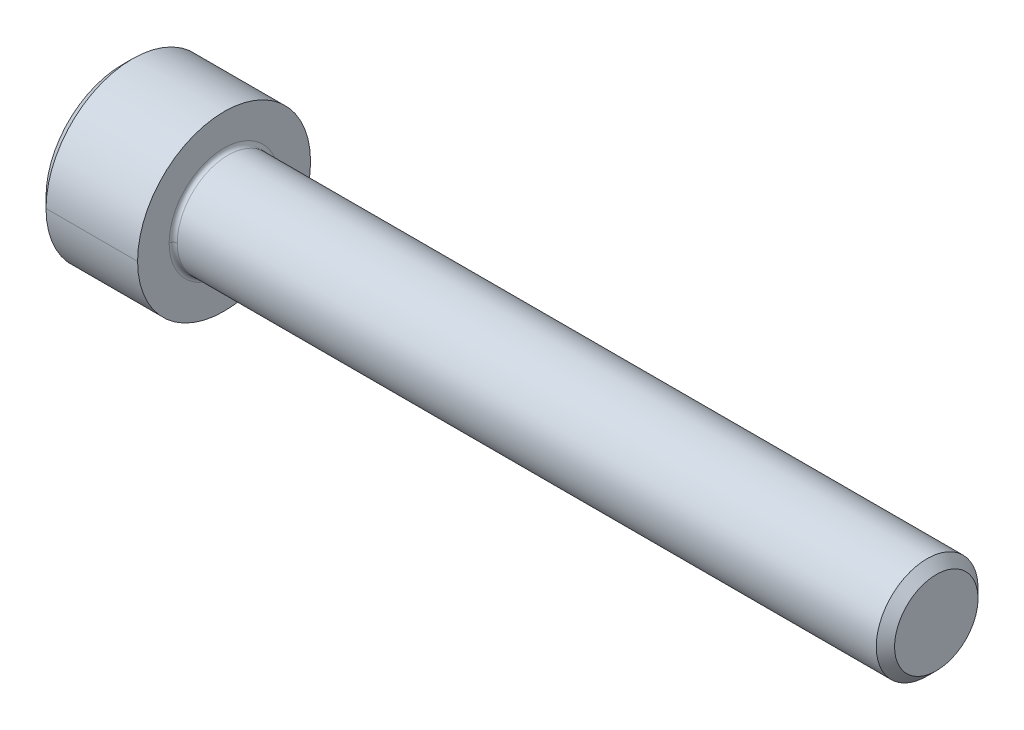
ISO-10303-21;
HEADER;
FILE_DESCRIPTION(('STEP AP214'),'2;1');
FILE_NAME('part.step','',(''),(''),'','','');
FILE_SCHEMA(('AUTOMOTIVE_DESIGN { 1 0 10303 214 1 1 1 1 }'));
ENDSEC;
DATA;
#1=APPLICATION_CONTEXT('core data for automotive mechanical design processes');
#2=APPLICATION_PROTOCOL_DEFINITION('international standard','automotive_design',2000,#1);
#3=PRODUCT_CONTEXT('',#1,'mechanical');
#4=PRODUCT('Part','Part','',(#3));
#5=PRODUCT_RELATED_PRODUCT_CATEGORY('part','',(#4));
#6=PRODUCT_DEFINITION_FORMATION('','',#4);
#7=PRODUCT_DEFINITION_CONTEXT('part definition',#1,'design');
#8=PRODUCT_DEFINITION('design','',#6,#7);
#9=PRODUCT_DEFINITION_SHAPE('','',#8);
#10=(LENGTH_UNIT() NAMED_UNIT(*) SI_UNIT(.MILLI.,.METRE.));
#11=(NAMED_UNIT(*) PLANE_ANGLE_UNIT() SI_UNIT($,.RADIAN.));
#12=(NAMED_UNIT(*) SI_UNIT($,.STERADIAN.) SOLID_ANGLE_UNIT());
#13=UNCERTAINTY_MEASURE_WITH_UNIT(LENGTH_MEASURE(1.E-05),#10,'distance_accuracy_value','');
#14=(GEOMETRIC_REPRESENTATION_CONTEXT(3) GLOBAL_UNCERTAINTY_ASSIGNED_CONTEXT((#13)) GLOBAL_UNIT_ASSIGNED_CONTEXT((#10,
#11,#12)) REPRESENTATION_CONTEXT('',''));
#15=CARTESIAN_POINT('',(0.,0.,0.));
#16=DIRECTION('',(0.,0.,1.));
#17=DIRECTION('',(1.,0.,0.));
#18=AXIS2_PLACEMENT_3D('',#15,#16,#17);
#19=CARTESIAN_POINT('',(2.5,0.,0.));
#20=DIRECTION('',(-1.,0.,0.));
#21=DIRECTION('',(0.,0.,1.));
#22=AXIS2_PLACEMENT_3D('',#19,#20,#21);
#23=CONICAL_SURFACE('',#22,2.042,1.0471975511966);
#24=DIRECTION('',(-0.5,0.,0.866025403784437));
#25=VECTOR('',#24,1.);
#26=CARTESIAN_POINT('',(2.5,0.,2.042));
#27=LINE('',#26,#25);
#28=CARTESIAN_POINT('',(3.67894924968523,0.,0.));
#29=VERTEX_POINT('',#28);
#30=CARTESIAN_POINT('',(2.5,0.,2.042));
#31=VERTEX_POINT('',#30);
#32=EDGE_CURVE('E59',#29,#31,#27,.T.);
#33=ORIENTED_EDGE('',*,*,#32,.F.);
#34=DIRECTION('',(-0.5,0.,-0.866025403784437));
#35=VECTOR('',#34,1.);
#36=CARTESIAN_POINT('',(2.5,0.,-2.042));
#37=LINE('',#36,#35);
#38=CARTESIAN_POINT('',(2.5,0.,-2.042));
#39=VERTEX_POINT('',#38);
#40=EDGE_CURVE('E11',#29,#39,#37,.T.);
#41=ORIENTED_EDGE('',*,*,#40,.T.);
#42=CARTESIAN_POINT('',(2.5,0.,0.));
#43=DIRECTION('',(-1.,0.,0.));
#44=DIRECTION('',(0.,0.,1.));
#45=AXIS2_PLACEMENT_3D('',#42,#43,#44);
#46=CIRCLE('',#45,2.042);
#47=CARTESIAN_POINT('',(2.5,-1.76842387452783,-1.021));
#48=VERTEX_POINT('',#47);
#49=EDGE_CURVE('E47',#39,#48,#46,.T.);
#50=ORIENTED_EDGE('',*,*,#49,.T.);
#51=CARTESIAN_POINT('',(2.5,0.,0.));
#52=DIRECTION('',(-1.,0.,0.));
#53=DIRECTION('',(0.,0.,1.));
#54=AXIS2_PLACEMENT_3D('',#51,#52,#53);
#55=CIRCLE('',#54,2.042);
#56=CARTESIAN_POINT('',(2.5,-1.76842387452783,1.021));
#57=VERTEX_POINT('',#56);
#58=EDGE_CURVE('E225',#48,#57,#55,.T.);
#59=ORIENTED_EDGE('',*,*,#58,.T.);
#60=CARTESIAN_POINT('',(2.5,0.,0.));
#61=DIRECTION('',(-1.,0.,0.));
#62=DIRECTION('',(0.,0.,1.));
#63=AXIS2_PLACEMENT_3D('',#60,#61,#62);
#64=CIRCLE('',#63,2.042);
#65=EDGE_CURVE('E264',#57,#31,#64,.T.);
#66=ORIENTED_EDGE('',*,*,#65,.T.);
#67=EDGE_LOOP('',(#33,#41,#50,#59,#66));
#68=FACE_BOUND('',#67,.T.);
#69=ADVANCED_FACE('F36',(#68),#23,.F.);
#70=CARTESIAN_POINT('',(5.2,0.,0.));
#71=DIRECTION('',(1.,0.,0.));
#72=DIRECTION('',(0.,0.,-1.));
#73=AXIS2_PLACEMENT_3D('',#70,#71,#72);
#74=TOROIDAL_SURFACE('',#73,2.7,0.2);
#75=CARTESIAN_POINT('',(5.2,0.,0.));
#76=DIRECTION('',(1.,0.,0.));
#77=DIRECTION('',(0.,0.,-1.));
#78=AXIS2_PLACEMENT_3D('',#75,#76,#77);
#79=CIRCLE('',#78,2.5);
#80=CARTESIAN_POINT('',(5.2,0.,2.5));
#81=VERTEX_POINT('',#80);
#82=CARTESIAN_POINT('',(5.2,0.,-2.5));
#83=VERTEX_POINT('',#82);
#84=EDGE_CURVE('E84',#81,#83,#79,.T.);
#85=ORIENTED_EDGE('',*,*,#84,.F.);
#86=CARTESIAN_POINT('',(5.2,0.,2.7));
#87=DIRECTION('',(0.,1.,0.));
#88=DIRECTION('',(0.,0.,1.));
#89=AXIS2_PLACEMENT_3D('',#86,#87,#88);
#90=CIRCLE('',#89,0.2);
#91=CARTESIAN_POINT('',(5.,0.,2.7));
#92=VERTEX_POINT('',#91);
#93=EDGE_CURVE('E267',#81,#92,#90,.T.);
#94=ORIENTED_EDGE('',*,*,#93,.T.);
#95=CARTESIAN_POINT('',(5.,0.,0.));
#96=DIRECTION('',(-1.,0.,0.));
#97=DIRECTION('',(0.,0.,-1.));
#98=AXIS2_PLACEMENT_3D('',#95,#96,#97);
#99=CIRCLE('',#98,2.7);
#100=CARTESIAN_POINT('',(5.,0.,-2.7));
#101=VERTEX_POINT('',#100);
#102=EDGE_CURVE('E99',#101,#92,#99,.T.);
#103=ORIENTED_EDGE('',*,*,#102,.F.);
#104=CARTESIAN_POINT('',(5.2,0.,-2.7));
#105=DIRECTION('',(0.,-1.,0.));
#106=DIRECTION('',(0.,0.,-1.));
#107=AXIS2_PLACEMENT_3D('',#104,#105,#106);
#108=CIRCLE('',#107,0.2);
#109=EDGE_CURVE('E237',#83,#101,#108,.T.);
#110=ORIENTED_EDGE('',*,*,#109,.F.);
#111=EDGE_LOOP('',(#85,#94,#103,#110));
#112=FACE_BOUND('',#111,.T.);
#113=ADVANCED_FACE('F397',(#112),#74,.F.);
#114=CARTESIAN_POINT('',(0.,0.,0.));
#115=DIRECTION('',(1.,0.,0.));
#116=DIRECTION('',(0.,0.,-1.));
#117=AXIS2_PLACEMENT_3D('',#114,#115,#116);
#118=CONICAL_SURFACE('',#117,3.75,0.785398163397446);
#119=CARTESIAN_POINT('',(0.,0.,0.));
#120=DIRECTION('',(-1.,0.,0.));
#121=DIRECTION('',(0.,0.,1.));
#122=AXIS2_PLACEMENT_3D('',#119,#120,#121);
#123=CIRCLE('',#122,3.75);
#124=CARTESIAN_POINT('',(0.,0.,3.75));
#125=VERTEX_POINT('',#124);
#126=CARTESIAN_POINT('',(0.,0.,-3.75));
#127=VERTEX_POINT('',#126);
#128=EDGE_CURVE('E281',#125,#127,#123,.T.);
#129=ORIENTED_EDGE('',*,*,#128,.F.);
#130=DIRECTION('',(0.707106781186549,0.,0.707106781186546));
#131=VECTOR('',#130,1.);
#132=CARTESIAN_POINT('',(0.,0.,3.75));
#133=LINE('',#132,#131);
#134=CARTESIAN_POINT('',(0.5,0.,4.25));
#135=VERTEX_POINT('',#134);
#136=EDGE_CURVE('E284',#125,#135,#133,.T.);
#137=ORIENTED_EDGE('',*,*,#136,.T.);
#138=CARTESIAN_POINT('',(0.5,0.,0.));
#139=DIRECTION('',(-1.,0.,0.));
#140=DIRECTION('',(0.,0.,1.));
#141=AXIS2_PLACEMENT_3D('',#138,#139,#140);
#142=CIRCLE('',#141,4.25);
#143=CARTESIAN_POINT('',(0.5,0.,-4.25));
#144=VERTEX_POINT('',#143);
#145=EDGE_CURVE('E299',#135,#144,#142,.T.);
#146=ORIENTED_EDGE('',*,*,#145,.T.);
#147=DIRECTION('',(0.707106781186549,0.,-0.707106781186546));
#148=VECTOR('',#147,1.);
#149=CARTESIAN_POINT('',(0.,0.,-3.75));
#150=LINE('',#149,#148);
#151=EDGE_CURVE('E226',#127,#144,#150,.T.);
#152=ORIENTED_EDGE('',*,*,#151,.F.);
#153=EDGE_LOOP('',(#129,#137,#146,#152));
#154=FACE_BOUND('',#153,.T.);
#155=ADVANCED_FACE('F38',(#154),#118,.T.);
#156=CARTESIAN_POINT('',(-31.75,0.,0.));
#157=DIRECTION('',(-1.,0.,0.));
#158=DIRECTION('',(0.,0.,1.));
#159=AXIS2_PLACEMENT_3D('',#156,#157,#158);
#160=CYLINDRICAL_SURFACE('',#159,4.25);
#161=CARTESIAN_POINT('',(5.,0.,0.));
#162=DIRECTION('',(-1.,0.,0.));
#163=DIRECTION('',(0.,0.,1.));
#164=AXIS2_PLACEMENT_3D('',#161,#162,#163);
#165=CIRCLE('',#164,4.25);
#166=CARTESIAN_POINT('',(5.,0.,4.25));
#167=VERTEX_POINT('',#166);
#168=CARTESIAN_POINT('',(5.,0.,-4.25));
#169=VERTEX_POINT('',#168);
#170=EDGE_CURVE('E295',#167,#169,#165,.T.);
#171=ORIENTED_EDGE('',*,*,#170,.T.);
#172=DIRECTION('',(-1.,0.,0.));
#173=VECTOR('',#172,1.);
#174=CARTESIAN_POINT('',(-31.75,0.,-4.25));
#175=LINE('',#174,#173);
#176=EDGE_CURVE('E300',#169,#144,#175,.T.);
#177=ORIENTED_EDGE('',*,*,#176,.T.);
#178=ORIENTED_EDGE('',*,*,#145,.F.);
#179=DIRECTION('',(-1.,0.,0.));
#180=VECTOR('',#179,1.);
#181=CARTESIAN_POINT('',(-31.75,0.,4.25));
#182=LINE('',#181,#180);
#183=EDGE_CURVE('E229',#167,#135,#182,.T.);
#184=ORIENTED_EDGE('',*,*,#183,.F.);
#185=EDGE_LOOP('',(#171,#177,#178,#184));
#186=FACE_BOUND('',#185,.T.);
#187=ADVANCED_FACE('F326',(#186),#160,.T.);
#188=CARTESIAN_POINT('',(-31.75,0.,0.));
#189=DIRECTION('',(-1.,0.,0.));
#190=DIRECTION('',(0.,0.,1.));
#191=AXIS2_PLACEMENT_3D('',#188,#189,#190);
#192=CYLINDRICAL_SURFACE('',#191,2.5);
#193=CARTESIAN_POINT('',(5.2,0.,0.));
#194=DIRECTION('',(1.,0.,0.));
#195=DIRECTION('',(0.,0.,-1.));
#196=AXIS2_PLACEMENT_3D('',#193,#194,#195);
#197=CIRCLE('',#196,2.5);
#198=EDGE_CURVE('E280',#83,#81,#197,.T.);
#199=ORIENTED_EDGE('',*,*,#198,.T.);
#200=ORIENTED_EDGE('',*,*,#84,.T.);
#201=EDGE_LOOP('',(#199,#200));
#202=FACE_BOUND('',#201,.T.);
#203=CARTESIAN_POINT('',(39.55,0.,0.));
#204=DIRECTION('',(-1.,0.,0.));
#205=DIRECTION('',(0.,0.,1.));
#206=AXIS2_PLACEMENT_3D('',#203,#204,#205);
#207=CIRCLE('',#206,2.5);
#208=CARTESIAN_POINT('',(39.55,0.,2.5));
#209=VERTEX_POINT('',#208);
#210=EDGE_CURVE('E354',#209,#209,#207,.T.);
#211=ORIENTED_EDGE('',*,*,#210,.T.);
#212=EDGE_LOOP('',(#211));
#213=FACE_BOUND('',#212,.T.);
#214=ADVANCED_FACE('F423',(#202,#213),#192,.T.);
#215=CARTESIAN_POINT('',(0.,0.,0.));
#216=DIRECTION('',(-1.,0.,0.));
#217=DIRECTION('',(0.,0.,1.));
#218=AXIS2_PLACEMENT_3D('',#215,#216,#217);
#219=PLANE('',#218);
#220=CARTESIAN_POINT('',(0.,0.,0.));
#221=DIRECTION('',(-1.,0.,0.));
#222=DIRECTION('',(0.,0.,1.));
#223=AXIS2_PLACEMENT_3D('',#220,#221,#222);
#224=CIRCLE('',#223,3.75);
#225=EDGE_CURVE('E276',#127,#125,#224,.T.);
#226=ORIENTED_EDGE('',*,*,#225,.T.);
#227=ORIENTED_EDGE('',*,*,#128,.T.);
#228=EDGE_LOOP('',(#226,#227));
#229=FACE_BOUND('',#228,.T.);
#230=DIRECTION('',(0.,-0.5,0.866025403784439));
#231=VECTOR('',#230,1.);
#232=CARTESIAN_POINT('',(0.,2.35789849937043,0.));
#233=LINE('',#232,#231);
#234=CARTESIAN_POINT('',(0.,2.35789849937043,0.));
#235=VERTEX_POINT('',#234);
#236=CARTESIAN_POINT('',(0.,1.17894924968522,2.042));
#237=VERTEX_POINT('',#236);
#238=EDGE_CURVE('E245',#235,#237,#233,.T.);
#239=ORIENTED_EDGE('',*,*,#238,.T.);
#240=DIRECTION('',(0.,1.,0.));
#241=VECTOR('',#240,1.);
#242=CARTESIAN_POINT('',(0.,-1.17894924968522,2.042));
#243=LINE('',#242,#241);
#244=CARTESIAN_POINT('',(0.,-1.17894924968522,2.042));
#245=VERTEX_POINT('',#244);
#246=EDGE_CURVE('E344',#245,#237,#243,.T.);
#247=ORIENTED_EDGE('',*,*,#246,.F.);
#248=DIRECTION('',(0.,-0.5,-0.866025403784438));
#249=VECTOR('',#248,1.);
#250=CARTESIAN_POINT('',(0.,-1.17894924968522,2.042));
#251=LINE('',#250,#249);
#252=CARTESIAN_POINT('',(0.,-2.35789849937043,0.));
#253=VERTEX_POINT('',#252);
#254=EDGE_CURVE('E241',#245,#253,#251,.T.);
#255=ORIENTED_EDGE('',*,*,#254,.T.);
#256=DIRECTION('',(0.,0.5,-0.866025403784439));
#257=VECTOR('',#256,1.);
#258=CARTESIAN_POINT('',(0.,-2.35789849937043,0.));
#259=LINE('',#258,#257);
#260=CARTESIAN_POINT('',(0.,-1.17894924968522,-2.042));
#261=VERTEX_POINT('',#260);
#262=EDGE_CURVE('E238',#253,#261,#259,.T.);
#263=ORIENTED_EDGE('',*,*,#262,.T.);
#264=DIRECTION('',(0.,-1.,0.));
#265=VECTOR('',#264,1.);
#266=CARTESIAN_POINT('',(0.,1.17894924968521,-2.042));
#267=LINE('',#266,#265);
#268=CARTESIAN_POINT('',(0.,1.17894924968521,-2.042));
#269=VERTEX_POINT('',#268);
#270=EDGE_CURVE('E189',#269,#261,#267,.T.);
#271=ORIENTED_EDGE('',*,*,#270,.F.);
#272=DIRECTION('',(0.,-0.5,-0.866025403784438));
#273=VECTOR('',#272,1.);
#274=CARTESIAN_POINT('',(0.,2.35789849937043,0.));
#275=LINE('',#274,#273);
#276=EDGE_CURVE('E214',#235,#269,#275,.T.);
#277=ORIENTED_EDGE('',*,*,#276,.F.);
#278=EDGE_LOOP('',(#239,#247,#255,#263,#271,#277));
#279=FACE_BOUND('',#278,.T.);
#280=ADVANCED_FACE('F416',(#229,#279),#219,.T.);
#281=CARTESIAN_POINT('',(5.,4.25,0.));
#282=DIRECTION('',(1.,0.,0.));
#283=DIRECTION('',(0.,1.,0.));
#284=AXIS2_PLACEMENT_3D('',#281,#282,#283);
#285=PLANE('',#284);
#286=ORIENTED_EDGE('',*,*,#170,.F.);
#287=CARTESIAN_POINT('',(5.,0.,0.));
#288=DIRECTION('',(-1.,0.,0.));
#289=DIRECTION('',(0.,0.,1.));
#290=AXIS2_PLACEMENT_3D('',#287,#288,#289);
#291=CIRCLE('',#290,4.25);
#292=EDGE_CURVE('E232',#169,#167,#291,.T.);
#293=ORIENTED_EDGE('',*,*,#292,.F.);
#294=EDGE_LOOP('',(#286,#293));
#295=FACE_BOUND('',#294,.T.);
#296=ORIENTED_EDGE('',*,*,#102,.T.);
#297=CARTESIAN_POINT('',(5.,0.,0.));
#298=DIRECTION('',(-1.,0.,0.));
#299=DIRECTION('',(0.,0.,-1.));
#300=AXIS2_PLACEMENT_3D('',#297,#298,#299);
#301=CIRCLE('',#300,2.7);
#302=EDGE_CURVE('E285',#92,#101,#301,.T.);
#303=ORIENTED_EDGE('',*,*,#302,.T.);
#304=EDGE_LOOP('',(#296,#303));
#305=FACE_BOUND('',#304,.T.);
#306=ADVANCED_FACE('F414',(#295,#305),#285,.T.);
#307=CARTESIAN_POINT('',(-31.75,0.,0.));
#308=DIRECTION('',(-1.,0.,0.));
#309=DIRECTION('',(0.,0.,1.));
#310=AXIS2_PLACEMENT_3D('',#307,#308,#309);
#311=CYLINDRICAL_SURFACE('',#310,4.25);
#312=ORIENTED_EDGE('',*,*,#176,.F.);
#313=ORIENTED_EDGE('',*,*,#292,.T.);
#314=ORIENTED_EDGE('',*,*,#183,.T.);
#315=CARTESIAN_POINT('',(0.5,0.,0.));
#316=DIRECTION('',(-1.,0.,0.));
#317=DIRECTION('',(0.,0.,1.));
#318=AXIS2_PLACEMENT_3D('',#315,#316,#317);
#319=CIRCLE('',#318,4.25);
#320=EDGE_CURVE('E222',#144,#135,#319,.T.);
#321=ORIENTED_EDGE('',*,*,#320,.F.);
#322=EDGE_LOOP('',(#312,#313,#314,#321));
#323=FACE_BOUND('',#322,.T.);
#324=ADVANCED_FACE('F320',(#323),#311,.T.);
#325=CARTESIAN_POINT('',(0.,0.,0.));
#326=DIRECTION('',(1.,0.,0.));
#327=DIRECTION('',(0.,0.,-1.));
#328=AXIS2_PLACEMENT_3D('',#325,#326,#327);
#329=CONICAL_SURFACE('',#328,3.75,0.785398163397446);
#330=ORIENTED_EDGE('',*,*,#136,.F.);
#331=ORIENTED_EDGE('',*,*,#225,.F.);
#332=ORIENTED_EDGE('',*,*,#151,.T.);
#333=ORIENTED_EDGE('',*,*,#320,.T.);
#334=EDGE_LOOP('',(#330,#331,#332,#333));
#335=FACE_BOUND('',#334,.T.);
#336=ADVANCED_FACE('F315',(#335),#329,.T.);
#337=CARTESIAN_POINT('',(5.2,0.,0.));
#338=DIRECTION('',(1.,0.,0.));
#339=DIRECTION('',(0.,0.,-1.));
#340=AXIS2_PLACEMENT_3D('',#337,#338,#339);
#341=TOROIDAL_SURFACE('',#340,2.7,0.2);
#342=ORIENTED_EDGE('',*,*,#93,.F.);
#343=ORIENTED_EDGE('',*,*,#198,.F.);
#344=ORIENTED_EDGE('',*,*,#109,.T.);
#345=ORIENTED_EDGE('',*,*,#302,.F.);
#346=EDGE_LOOP('',(#342,#343,#344,#345));
#347=FACE_BOUND('',#346,.T.);
#348=ADVANCED_FACE('F413',(#347),#341,.F.);
#349=CARTESIAN_POINT('',(2.5,2.35789849937043,0.));
#350=DIRECTION('',(0.,-0.866025403784439,-0.5));
#351=DIRECTION('',(0.,0.5,-0.866025403784439));
#352=AXIS2_PLACEMENT_3D('',#349,#350,#351);
#353=PLANE('',#352);
#354=ORIENTED_EDGE('',*,*,#238,.F.);
#355=DIRECTION('',(-1.,0.,0.));
#356=VECTOR('',#355,1.);
#357=CARTESIAN_POINT('',(2.5,2.35789849937043,0.));
#358=LINE('',#357,#356);
#359=CARTESIAN_POINT('',(2.5,2.35789849937043,0.));
#360=VERTEX_POINT('',#359);
#361=EDGE_CURVE('E206',#360,#235,#358,.T.);
#362=ORIENTED_EDGE('',*,*,#361,.F.);
#363=DIRECTION('',(0.,-0.5,0.866025403784439));
#364=VECTOR('',#363,1.);
#365=CARTESIAN_POINT('',(2.5,2.35789849937043,0.));
#366=LINE('',#365,#364);
#367=CARTESIAN_POINT('',(2.5,1.76842387452783,1.021));
#368=VERTEX_POINT('',#367);
#369=EDGE_CURVE('E233',#360,#368,#366,.T.);
#370=ORIENTED_EDGE('',*,*,#369,.T.);
#371=DIRECTION('',(0.,-0.5,0.866025403784439));
#372=VECTOR('',#371,1.);
#373=CARTESIAN_POINT('',(2.5,2.35789849937043,0.));
#374=LINE('',#373,#372);
#375=CARTESIAN_POINT('',(2.5,1.17894924968522,2.042));
#376=VERTEX_POINT('',#375);
#377=EDGE_CURVE('E40',#368,#376,#374,.T.);
#378=ORIENTED_EDGE('',*,*,#377,.T.);
#379=DIRECTION('',(-1.,0.,0.));
#380=VECTOR('',#379,1.);
#381=CARTESIAN_POINT('',(2.5,1.17894924968522,2.042));
#382=LINE('',#381,#380);
#383=EDGE_CURVE('E371',#376,#237,#382,.T.);
#384=ORIENTED_EDGE('',*,*,#383,.T.);
#385=EDGE_LOOP('',(#354,#362,#370,#378,#384));
#386=FACE_BOUND('',#385,.T.);
#387=ADVANCED_FACE('F460',(#386),#353,.T.);
#388=CARTESIAN_POINT('',(2.5,-1.17894924968522,2.042));
#389=DIRECTION('',(0.,0.,1.));
#390=DIRECTION('',(1.,0.,0.));
#391=AXIS2_PLACEMENT_3D('',#388,#389,#390);
#392=PLANE('',#391);
#393=ORIENTED_EDGE('',*,*,#246,.T.);
#394=ORIENTED_EDGE('',*,*,#383,.F.);
#395=DIRECTION('',(0.,1.,0.));
#396=VECTOR('',#395,1.);
#397=CARTESIAN_POINT('',(2.5,-1.17894924968522,2.042));
#398=LINE('',#397,#396);
#399=EDGE_CURVE('E218',#31,#376,#398,.T.);
#400=ORIENTED_EDGE('',*,*,#399,.F.);
#401=DIRECTION('',(0.,1.,0.));
#402=VECTOR('',#401,1.);
#403=CARTESIAN_POINT('',(2.5,-1.17894924968522,2.042));
#404=LINE('',#403,#402);
#405=CARTESIAN_POINT('',(2.5,-1.17894924968522,2.042));
#406=VERTEX_POINT('',#405);
#407=EDGE_CURVE('E207',#406,#31,#404,.T.);
#408=ORIENTED_EDGE('',*,*,#407,.F.);
#409=DIRECTION('',(-1.,0.,0.));
#410=VECTOR('',#409,1.);
#411=CARTESIAN_POINT('',(2.5,-1.17894924968522,2.042));
#412=LINE('',#411,#410);
#413=EDGE_CURVE('E340',#406,#245,#412,.T.);
#414=ORIENTED_EDGE('',*,*,#413,.T.);
#415=EDGE_LOOP('',(#393,#394,#400,#408,#414));
#416=FACE_BOUND('',#415,.T.);
#417=ADVANCED_FACE('F450',(#416),#392,.F.);
#418=CARTESIAN_POINT('',(2.5,-1.17894924968522,2.042));
#419=DIRECTION('',(0.,0.866025403784438,-0.5));
#420=DIRECTION('',(-1.,0.,0.));
#421=AXIS2_PLACEMENT_3D('',#418,#419,#420);
#422=PLANE('',#421);
#423=ORIENTED_EDGE('',*,*,#254,.F.);
#424=ORIENTED_EDGE('',*,*,#413,.F.);
#425=DIRECTION('',(0.,-0.5,-0.866025403784438));
#426=VECTOR('',#425,1.);
#427=CARTESIAN_POINT('',(2.5,-1.17894924968522,2.042));
#428=LINE('',#427,#426);
#429=EDGE_CURVE('E262',#406,#57,#428,.T.);
#430=ORIENTED_EDGE('',*,*,#429,.T.);
#431=DIRECTION('',(0.,-0.5,-0.866025403784438));
#432=VECTOR('',#431,1.);
#433=CARTESIAN_POINT('',(2.5,-1.17894924968522,2.042));
#434=LINE('',#433,#432);
#435=CARTESIAN_POINT('',(2.5,-2.35789849937043,0.));
#436=VERTEX_POINT('',#435);
#437=EDGE_CURVE('E258',#57,#436,#434,.T.);
#438=ORIENTED_EDGE('',*,*,#437,.T.);
#439=DIRECTION('',(-1.,0.,0.));
#440=VECTOR('',#439,1.);
#441=CARTESIAN_POINT('',(2.5,-2.35789849937043,0.));
#442=LINE('',#441,#440);
#443=EDGE_CURVE('E263',#436,#253,#442,.T.);
#444=ORIENTED_EDGE('',*,*,#443,.T.);
#445=EDGE_LOOP('',(#423,#424,#430,#438,#444));
#446=FACE_BOUND('',#445,.T.);
#447=ADVANCED_FACE('F436',(#446),#422,.T.);
#448=CARTESIAN_POINT('',(2.5,-2.35789849937043,0.));
#449=DIRECTION('',(0.,0.866025403784439,0.5));
#450=DIRECTION('',(1.,0.,0.));
#451=AXIS2_PLACEMENT_3D('',#448,#449,#450);
#452=PLANE('',#451);
#453=ORIENTED_EDGE('',*,*,#262,.F.);
#454=ORIENTED_EDGE('',*,*,#443,.F.);
#455=DIRECTION('',(0.,0.5,-0.866025403784439));
#456=VECTOR('',#455,1.);
#457=CARTESIAN_POINT('',(2.5,-2.35789849937043,0.));
#458=LINE('',#457,#456);
#459=EDGE_CURVE('E198',#436,#48,#458,.T.);
#460=ORIENTED_EDGE('',*,*,#459,.T.);
#461=DIRECTION('',(0.,0.5,-0.866025403784439));
#462=VECTOR('',#461,1.);
#463=CARTESIAN_POINT('',(2.5,-2.35789849937043,0.));
#464=LINE('',#463,#462);
#465=CARTESIAN_POINT('',(2.5,-1.17894924968522,-2.042));
#466=VERTEX_POINT('',#465);
#467=EDGE_CURVE('E193',#48,#466,#464,.T.);
#468=ORIENTED_EDGE('',*,*,#467,.T.);
#469=DIRECTION('',(-1.,0.,0.));
#470=VECTOR('',#469,1.);
#471=CARTESIAN_POINT('',(2.5,-1.17894924968522,-2.042));
#472=LINE('',#471,#470);
#473=EDGE_CURVE('E181',#466,#261,#472,.T.);
#474=ORIENTED_EDGE('',*,*,#473,.T.);
#475=EDGE_LOOP('',(#453,#454,#460,#468,#474));
#476=FACE_BOUND('',#475,.T.);
#477=ADVANCED_FACE('F196',(#476),#452,.T.);
#478=CARTESIAN_POINT('',(2.5,1.17894924968521,-2.042));
#479=DIRECTION('',(0.,0.,-1.));
#480=DIRECTION('',(0.,-1.,0.));
#481=AXIS2_PLACEMENT_3D('',#478,#479,#480);
#482=PLANE('',#481);
#483=ORIENTED_EDGE('',*,*,#270,.T.);
#484=ORIENTED_EDGE('',*,*,#473,.F.);
#485=DIRECTION('',(0.,-1.,0.));
#486=VECTOR('',#485,1.);
#487=CARTESIAN_POINT('',(2.5,1.17894924968521,-2.042));
#488=LINE('',#487,#486);
#489=EDGE_CURVE('E185',#39,#466,#488,.T.);
#490=ORIENTED_EDGE('',*,*,#489,.F.);
#491=DIRECTION('',(0.,-1.,0.));
#492=VECTOR('',#491,1.);
#493=CARTESIAN_POINT('',(2.5,1.17894924968521,-2.042));
#494=LINE('',#493,#492);
#495=CARTESIAN_POINT('',(2.5,1.17894924968521,-2.042));
#496=VERTEX_POINT('',#495);
#497=EDGE_CURVE('E257',#496,#39,#494,.T.);
#498=ORIENTED_EDGE('',*,*,#497,.F.);
#499=DIRECTION('',(-1.,0.,0.));
#500=VECTOR('',#499,1.);
#501=CARTESIAN_POINT('',(2.5,1.17894924968521,-2.042));
#502=LINE('',#501,#500);
#503=EDGE_CURVE('E275',#496,#269,#502,.T.);
#504=ORIENTED_EDGE('',*,*,#503,.T.);
#505=EDGE_LOOP('',(#483,#484,#490,#498,#504));
#506=FACE_BOUND('',#505,.T.);
#507=ADVANCED_FACE('F183',(#506),#482,.F.);
#508=CARTESIAN_POINT('',(2.5,2.35789849937043,0.));
#509=DIRECTION('',(0.,0.866025403784438,-0.5));
#510=DIRECTION('',(-1.,0.,0.));
#511=AXIS2_PLACEMENT_3D('',#508,#509,#510);
#512=PLANE('',#511);
#513=ORIENTED_EDGE('',*,*,#276,.T.);
#514=ORIENTED_EDGE('',*,*,#503,.F.);
#515=DIRECTION('',(0.,-0.5,-0.866025403784438));
#516=VECTOR('',#515,1.);
#517=CARTESIAN_POINT('',(2.5,2.35789849937043,0.));
#518=LINE('',#517,#516);
#519=CARTESIAN_POINT('',(2.5,1.76842387452782,-1.021));
#520=VERTEX_POINT('',#519);
#521=EDGE_CURVE('E252',#520,#496,#518,.T.);
#522=ORIENTED_EDGE('',*,*,#521,.F.);
#523=DIRECTION('',(0.,-0.5,-0.866025403784438));
#524=VECTOR('',#523,1.);
#525=CARTESIAN_POINT('',(2.5,2.35789849937043,0.));
#526=LINE('',#525,#524);
#527=EDGE_CURVE('E256',#360,#520,#526,.T.);
#528=ORIENTED_EDGE('',*,*,#527,.F.);
#529=ORIENTED_EDGE('',*,*,#361,.T.);
#530=EDGE_LOOP('',(#513,#514,#522,#528,#529));
#531=FACE_BOUND('',#530,.T.);
#532=ADVANCED_FACE('F447',(#531),#512,.F.);
#533=CARTESIAN_POINT('',(2.5,2.35789849937043,0.));
#534=DIRECTION('',(1.,0.,0.));
#535=DIRECTION('',(0.,1.,0.));
#536=AXIS2_PLACEMENT_3D('',#533,#534,#535);
#537=PLANE('',#536);
#538=ORIENTED_EDGE('',*,*,#489,.T.);
#539=ORIENTED_EDGE('',*,*,#467,.F.);
#540=ORIENTED_EDGE('',*,*,#49,.F.);
#541=EDGE_LOOP('',(#538,#539,#540));
#542=FACE_BOUND('',#541,.T.);
#543=ADVANCED_FACE('F203',(#542),#537,.F.);
#544=CARTESIAN_POINT('',(2.5,2.35789849937043,0.));
#545=DIRECTION('',(1.,0.,0.));
#546=DIRECTION('',(0.,1.,0.));
#547=AXIS2_PLACEMENT_3D('',#544,#545,#546);
#548=PLANE('',#547);
#549=ORIENTED_EDGE('',*,*,#459,.F.);
#550=ORIENTED_EDGE('',*,*,#437,.F.);
#551=ORIENTED_EDGE('',*,*,#58,.F.);
#552=EDGE_LOOP('',(#549,#550,#551));
#553=FACE_BOUND('',#552,.T.);
#554=ADVANCED_FACE('F443',(#553),#548,.F.);
#555=CARTESIAN_POINT('',(2.5,2.35789849937043,0.));
#556=DIRECTION('',(1.,0.,0.));
#557=DIRECTION('',(0.,1.,0.));
#558=AXIS2_PLACEMENT_3D('',#555,#556,#557);
#559=PLANE('',#558);
#560=ORIENTED_EDGE('',*,*,#429,.F.);
#561=ORIENTED_EDGE('',*,*,#407,.T.);
#562=ORIENTED_EDGE('',*,*,#65,.F.);
#563=EDGE_LOOP('',(#560,#561,#562));
#564=FACE_BOUND('',#563,.T.);
#565=ADVANCED_FACE('F440',(#564),#559,.F.);
#566=CARTESIAN_POINT('',(2.5,2.35789849937043,0.));
#567=DIRECTION('',(1.,0.,0.));
#568=DIRECTION('',(0.,1.,0.));
#569=AXIS2_PLACEMENT_3D('',#566,#567,#568);
#570=PLANE('',#569);
#571=ORIENTED_EDGE('',*,*,#399,.T.);
#572=ORIENTED_EDGE('',*,*,#377,.F.);
#573=CARTESIAN_POINT('',(2.5,0.,0.));
#574=DIRECTION('',(-1.,0.,0.));
#575=DIRECTION('',(0.,0.,1.));
#576=AXIS2_PLACEMENT_3D('',#573,#574,#575);
#577=CIRCLE('',#576,2.042);
#578=EDGE_CURVE('E250',#31,#368,#577,.T.);
#579=ORIENTED_EDGE('',*,*,#578,.F.);
#580=EDGE_LOOP('',(#571,#572,#579));
#581=FACE_BOUND('',#580,.T.);
#582=ADVANCED_FACE('F404',(#581),#570,.F.);
#583=CARTESIAN_POINT('',(2.5,2.35789849937043,0.));
#584=DIRECTION('',(1.,0.,0.));
#585=DIRECTION('',(0.,1.,0.));
#586=AXIS2_PLACEMENT_3D('',#583,#584,#585);
#587=PLANE('',#586);
#588=ORIENTED_EDGE('',*,*,#369,.F.);
#589=ORIENTED_EDGE('',*,*,#527,.T.);
#590=CARTESIAN_POINT('',(2.5,0.,0.));
#591=DIRECTION('',(-1.,0.,0.));
#592=DIRECTION('',(0.,0.,1.));
#593=AXIS2_PLACEMENT_3D('',#590,#591,#592);
#594=CIRCLE('',#593,2.042);
#595=EDGE_CURVE('E246',#368,#520,#594,.T.);
#596=ORIENTED_EDGE('',*,*,#595,.F.);
#597=EDGE_LOOP('',(#588,#589,#596));
#598=FACE_BOUND('',#597,.T.);
#599=ADVANCED_FACE('F410',(#598),#587,.F.);
#600=CARTESIAN_POINT('',(2.5,2.35789849937043,0.));
#601=DIRECTION('',(1.,0.,0.));
#602=DIRECTION('',(0.,1.,0.));
#603=AXIS2_PLACEMENT_3D('',#600,#601,#602);
#604=PLANE('',#603);
#605=ORIENTED_EDGE('',*,*,#521,.T.);
#606=ORIENTED_EDGE('',*,*,#497,.T.);
#607=CARTESIAN_POINT('',(2.5,0.,0.));
#608=DIRECTION('',(-1.,0.,0.));
#609=DIRECTION('',(0.,0.,1.));
#610=AXIS2_PLACEMENT_3D('',#607,#608,#609);
#611=CIRCLE('',#610,2.042);
#612=EDGE_CURVE('E251',#520,#39,#611,.T.);
#613=ORIENTED_EDGE('',*,*,#612,.F.);
#614=EDGE_LOOP('',(#605,#606,#613));
#615=FACE_BOUND('',#614,.T.);
#616=ADVANCED_FACE('F407',(#615),#604,.F.);
#617=CARTESIAN_POINT('',(2.5,0.,0.));
#618=DIRECTION('',(-1.,0.,0.));
#619=DIRECTION('',(0.,0.,1.));
#620=AXIS2_PLACEMENT_3D('',#617,#618,#619);
#621=CONICAL_SURFACE('',#620,2.042,1.0471975511966);
#622=ORIENTED_EDGE('',*,*,#40,.F.);
#623=ORIENTED_EDGE('',*,*,#32,.T.);
#624=ORIENTED_EDGE('',*,*,#578,.T.);
#625=ORIENTED_EDGE('',*,*,#595,.T.);
#626=ORIENTED_EDGE('',*,*,#612,.T.);
#627=EDGE_LOOP('',(#622,#623,#624,#625,#626));
#628=FACE_BOUND('',#627,.T.);
#629=ADVANCED_FACE('F393',(#628),#621,.F.);
#630=CARTESIAN_POINT('',(40.,0.,0.));
#631=DIRECTION('',(-1.,0.,0.));
#632=DIRECTION('',(0.,0.,1.));
#633=AXIS2_PLACEMENT_3D('',#630,#631,#632);
#634=CONICAL_SURFACE('',#633,2.05000000000002,0.785398163397439);
#635=ORIENTED_EDGE('',*,*,#210,.F.);
#636=EDGE_LOOP('',(#635));
#637=FACE_BOUND('',#636,.T.);
#638=CARTESIAN_POINT('',(40.,0.,0.));
#639=DIRECTION('',(-1.,0.,0.));
#640=DIRECTION('',(0.,0.,1.));
#641=AXIS2_PLACEMENT_3D('',#638,#639,#640);
#642=CIRCLE('',#641,2.05000000000002);
#643=CARTESIAN_POINT('',(40.,0.,2.05000000000002));
#644=VERTEX_POINT('',#643);
#645=EDGE_CURVE('E381',#644,#644,#642,.T.);
#646=ORIENTED_EDGE('',*,*,#645,.T.);
#647=EDGE_LOOP('',(#646));
#648=FACE_BOUND('',#647,.T.);
#649=ADVANCED_FACE('F385',(#637,#648),#634,.T.);
#650=CARTESIAN_POINT('',(40.,2.05000000000002,0.));
#651=DIRECTION('',(-1.,0.,0.));
#652=DIRECTION('',(0.,0.,1.));
#653=AXIS2_PLACEMENT_3D('',#650,#651,#652);
#654=PLANE('',#653);
#655=ORIENTED_EDGE('',*,*,#645,.F.);
#656=EDGE_LOOP('',(#655));
#657=FACE_BOUND('',#656,.T.);
#658=ADVANCED_FACE('F387',(#657),#654,.F.);
#659=CLOSED_SHELL('',(#69,#113,#155,#187,#214,#280,#306,#324,#336,#348,#387,#417,#447,#477,#507,
#532,#543,#554,#565,#582,#599,#616,#629,#649,#658));
#660=MANIFOLD_SOLID_BREP('B2',#659);
#661=ADVANCED_BREP_SHAPE_REPRESENTATION('',(#18,#660),#14);
#662=SHAPE_DEFINITION_REPRESENTATION(#9,#661);
ENDSEC;
END-ISO-10303-21;
